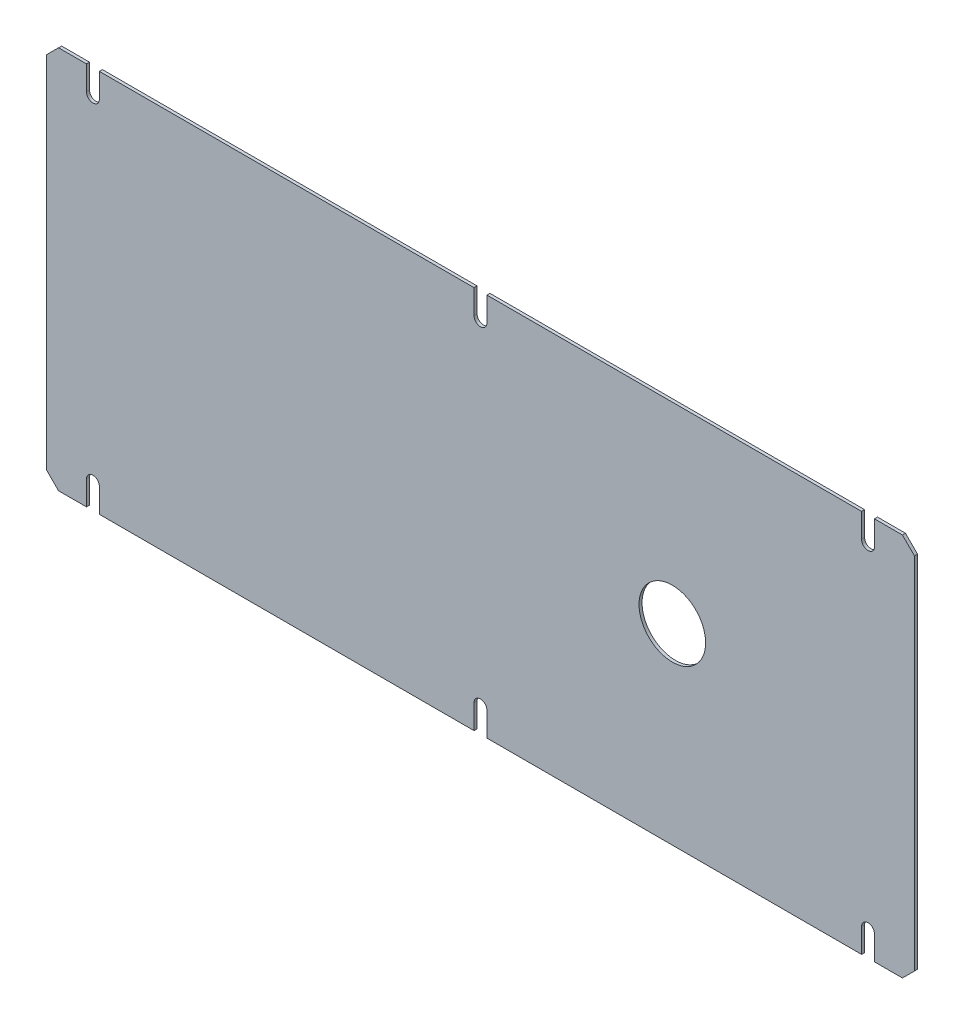
ISO-10303-21;
HEADER;
FILE_DESCRIPTION(('STEP AP214'),'2;1');
FILE_NAME('part.step','',(''),(''),'','','');
FILE_SCHEMA(('AUTOMOTIVE_DESIGN { 1 0 10303 214 1 1 1 1 }'));
ENDSEC;
DATA;
#1=APPLICATION_CONTEXT('core data for automotive mechanical design processes');
#2=APPLICATION_PROTOCOL_DEFINITION('international standard','automotive_design',2000,#1);
#3=PRODUCT_CONTEXT('',#1,'mechanical');
#4=PRODUCT('Part','Part','',(#3));
#5=PRODUCT_RELATED_PRODUCT_CATEGORY('part','',(#4));
#6=PRODUCT_DEFINITION_FORMATION('','',#4);
#7=PRODUCT_DEFINITION_CONTEXT('part definition',#1,'design');
#8=PRODUCT_DEFINITION('design','',#6,#7);
#9=PRODUCT_DEFINITION_SHAPE('','',#8);
#10=(LENGTH_UNIT() NAMED_UNIT(*) SI_UNIT(.MILLI.,.METRE.));
#11=(NAMED_UNIT(*) PLANE_ANGLE_UNIT() SI_UNIT($,.RADIAN.));
#12=(NAMED_UNIT(*) SI_UNIT($,.STERADIAN.) SOLID_ANGLE_UNIT());
#13=UNCERTAINTY_MEASURE_WITH_UNIT(LENGTH_MEASURE(1.E-05),#10,'distance_accuracy_value','');
#14=(GEOMETRIC_REPRESENTATION_CONTEXT(3) GLOBAL_UNCERTAINTY_ASSIGNED_CONTEXT((#13)) GLOBAL_UNIT_ASSIGNED_CONTEXT((#10,
#11,#12)) REPRESENTATION_CONTEXT('',''));
#15=CARTESIAN_POINT('',(0.,0.,0.));
#16=DIRECTION('',(0.,0.,1.));
#17=DIRECTION('',(1.,0.,0.));
#18=AXIS2_PLACEMENT_3D('',#15,#16,#17);
#19=CARTESIAN_POINT('',(-227.584,100.584,1.5875));
#20=DIRECTION('',(0.,-1.,0.));
#21=DIRECTION('',(0.,0.,-1.));
#22=AXIS2_PLACEMENT_3D('',#19,#20,#21);
#23=PLANE('',#22);
#24=DIRECTION('',(-1.,0.,0.));
#25=VECTOR('',#24,1.);
#26=CARTESIAN_POINT('',(-227.584,100.584,0.));
#27=LINE('',#26,#25);
#28=CARTESIAN_POINT('',(-206.5782,100.584,0.));
#29=VERTEX_POINT('',#28);
#30=CARTESIAN_POINT('',(-221.234,100.584,0.));
#31=VERTEX_POINT('',#30);
#32=EDGE_CURVE('E319',#29,#31,#27,.T.);
#33=ORIENTED_EDGE('',*,*,#32,.T.);
#34=DIRECTION('',(0.,0.,1.));
#35=VECTOR('',#34,1.);
#36=CARTESIAN_POINT('',(-221.234,100.584,1.5875));
#37=LINE('',#36,#35);
#38=CARTESIAN_POINT('',(-221.234,100.584,1.5875));
#39=VERTEX_POINT('',#38);
#40=EDGE_CURVE('E351',#31,#39,#37,.T.);
#41=ORIENTED_EDGE('',*,*,#40,.T.);
#42=DIRECTION('',(-1.,0.,0.));
#43=VECTOR('',#42,1.);
#44=CARTESIAN_POINT('',(-227.584,100.584,1.5875));
#45=LINE('',#44,#43);
#46=CARTESIAN_POINT('',(-206.5782,100.584,1.5875));
#47=VERTEX_POINT('',#46);
#48=EDGE_CURVE('E306',#47,#39,#45,.T.);
#49=ORIENTED_EDGE('',*,*,#48,.F.);
#50=DIRECTION('',(0.,0.,-1.));
#51=VECTOR('',#50,1.);
#52=CARTESIAN_POINT('',(-206.5782,100.584,-0.000999999999999916));
#53=LINE('',#52,#51);
#54=EDGE_CURVE('E864',#47,#29,#53,.T.);
#55=ORIENTED_EDGE('',*,*,#54,.T.);
#56=EDGE_LOOP('',(#33,#41,#49,#55));
#57=FACE_BOUND('',#56,.T.);
#58=ADVANCED_FACE('F38',(#57),#23,.F.);
#59=DIRECTION('',(0.,0.,1.));
#60=VECTOR('',#59,1.);
#61=CARTESIAN_POINT('',(-199.8218,100.584,-0.000999999999999916));
#62=LINE('',#61,#60);
#63=CARTESIAN_POINT('',(-199.8218,100.584,0.));
#64=VERTEX_POINT('',#63);
#65=CARTESIAN_POINT('',(-199.8218,100.584,1.5875));
#66=VERTEX_POINT('',#65);
#67=EDGE_CURVE('E887',#64,#66,#62,.T.);
#68=ORIENTED_EDGE('',*,*,#67,.T.);
#69=CARTESIAN_POINT('',(-3.3781999999999,100.584,1.5875));
#70=VERTEX_POINT('',#69);
#71=EDGE_CURVE('E270',#70,#66,#45,.T.);
#72=ORIENTED_EDGE('',*,*,#71,.F.);
#73=DIRECTION('',(0.,0.,-1.));
#74=VECTOR('',#73,1.);
#75=CARTESIAN_POINT('',(-3.3781999999999,100.584,-0.000999999999999916));
#76=LINE('',#75,#74);
#77=CARTESIAN_POINT('',(-3.3781999999999,100.584,0.));
#78=VERTEX_POINT('',#77);
#79=EDGE_CURVE('E413',#70,#78,#76,.T.);
#80=ORIENTED_EDGE('',*,*,#79,.T.);
#81=EDGE_CURVE('E865',#78,#64,#27,.T.);
#82=ORIENTED_EDGE('',*,*,#81,.T.);
#83=EDGE_LOOP('',(#68,#72,#80,#82));
#84=FACE_BOUND('',#83,.T.);
#85=ADVANCED_FACE('F508',(#84),#23,.F.);
#86=CARTESIAN_POINT('',(221.234,100.584,1.5875));
#87=VERTEX_POINT('',#86);
#88=CARTESIAN_POINT('',(206.5782,100.584,1.5875));
#89=VERTEX_POINT('',#88);
#90=EDGE_CURVE('E308',#87,#89,#45,.T.);
#91=ORIENTED_EDGE('',*,*,#90,.F.);
#92=DIRECTION('',(0.,0.,-1.));
#93=VECTOR('',#92,1.);
#94=CARTESIAN_POINT('',(221.234,100.584,1.5875));
#95=LINE('',#94,#93);
#96=CARTESIAN_POINT('',(221.234,100.584,0.));
#97=VERTEX_POINT('',#96);
#98=EDGE_CURVE('E12',#87,#97,#95,.T.);
#99=ORIENTED_EDGE('',*,*,#98,.T.);
#100=CARTESIAN_POINT('',(206.5782,100.584,0.));
#101=VERTEX_POINT('',#100);
#102=EDGE_CURVE('E320',#97,#101,#27,.T.);
#103=ORIENTED_EDGE('',*,*,#102,.T.);
#104=DIRECTION('',(0.,0.,1.));
#105=VECTOR('',#104,1.);
#106=CARTESIAN_POINT('',(206.5782,100.584,-0.000999999999999916));
#107=LINE('',#106,#105);
#108=EDGE_CURVE('E385',#101,#89,#107,.T.);
#109=ORIENTED_EDGE('',*,*,#108,.T.);
#110=EDGE_LOOP('',(#91,#99,#103,#109));
#111=FACE_BOUND('',#110,.T.);
#112=ADVANCED_FACE('F382',(#111),#23,.F.);
#113=DIRECTION('',(0.,0.,-1.));
#114=VECTOR('',#113,1.);
#115=CARTESIAN_POINT('',(199.8218,100.584,-0.000999999999999916));
#116=LINE('',#115,#114);
#117=CARTESIAN_POINT('',(199.8218,100.584,1.5875));
#118=VERTEX_POINT('',#117);
#119=CARTESIAN_POINT('',(199.8218,100.584,0.));
#120=VERTEX_POINT('',#119);
#121=EDGE_CURVE('E873',#118,#120,#116,.T.);
#122=ORIENTED_EDGE('',*,*,#121,.T.);
#123=CARTESIAN_POINT('',(3.37820000000009,100.584,0.));
#124=VERTEX_POINT('',#123);
#125=EDGE_CURVE('E323',#120,#124,#27,.T.);
#126=ORIENTED_EDGE('',*,*,#125,.T.);
#127=DIRECTION('',(0.,0.,1.));
#128=VECTOR('',#127,1.);
#129=CARTESIAN_POINT('',(3.37820000000009,100.584,-0.000999999999999916));
#130=LINE('',#129,#128);
#131=CARTESIAN_POINT('',(3.37820000000009,100.584,1.5875));
#132=VERTEX_POINT('',#131);
#133=EDGE_CURVE('E410',#124,#132,#130,.T.);
#134=ORIENTED_EDGE('',*,*,#133,.T.);
#135=EDGE_CURVE('E311',#118,#132,#45,.T.);
#136=ORIENTED_EDGE('',*,*,#135,.F.);
#137=EDGE_LOOP('',(#122,#126,#134,#136));
#138=FACE_BOUND('',#137,.T.);
#139=ADVANCED_FACE('F496',(#138),#23,.F.);
#140=CARTESIAN_POINT('',(0.,0.,1.5875));
#141=DIRECTION('',(0.,0.,1.));
#142=DIRECTION('',(1.,0.,0.));
#143=AXIS2_PLACEMENT_3D('',#140,#141,#142);
#144=PLANE('',#143);
#145=CARTESIAN_POINT('',(100.584,0.,1.5875));
#146=DIRECTION('',(0.,0.,1.));
#147=DIRECTION('',(1.,0.,0.));
#148=AXIS2_PLACEMENT_3D('',#145,#146,#147);
#149=CIRCLE('',#148,17.4625);
#150=CARTESIAN_POINT('',(118.0465,0.,1.5875));
#151=VERTEX_POINT('',#150);
#152=EDGE_CURVE('E282',#151,#151,#149,.T.);
#153=ORIENTED_EDGE('',*,*,#152,.F.);
#154=EDGE_LOOP('',(#153));
#155=FACE_BOUND('',#154,.T.);
#156=DIRECTION('',(0.,-1.,0.));
#157=VECTOR('',#156,1.);
#158=CARTESIAN_POINT('',(-227.584,100.584,1.5875));
#159=LINE('',#158,#157);
#160=CARTESIAN_POINT('',(-227.584,94.2340000000001,1.5875));
#161=VERTEX_POINT('',#160);
#162=CARTESIAN_POINT('',(-227.584,-94.234,1.5875));
#163=VERTEX_POINT('',#162);
#164=EDGE_CURVE('E310',#161,#163,#159,.T.);
#165=ORIENTED_EDGE('',*,*,#164,.T.);
#166=DIRECTION('',(-0.707106781186548,0.707106781186548,0.));
#167=VECTOR('',#166,1.);
#168=CARTESIAN_POINT('',(-160.909,-160.909,1.5875));
#169=LINE('',#168,#167);
#170=CARTESIAN_POINT('',(-221.234,-100.584,1.5875));
#171=VERTEX_POINT('',#170);
#172=EDGE_CURVE('E349',#163,#171,#169,.F.);
#173=ORIENTED_EDGE('',*,*,#172,.T.);
#174=DIRECTION('',(1.,0.,0.));
#175=VECTOR('',#174,1.);
#176=CARTESIAN_POINT('',(-227.584,-100.584,1.5875));
#177=LINE('',#176,#175);
#178=CARTESIAN_POINT('',(-206.5782,-100.584,1.5875));
#179=VERTEX_POINT('',#178);
#180=EDGE_CURVE('E314',#171,#179,#177,.T.);
#181=ORIENTED_EDGE('',*,*,#180,.T.);
#182=DIRECTION('',(0.,-1.,0.));
#183=VECTOR('',#182,1.);
#184=CARTESIAN_POINT('',(-206.5782,-87.884,1.5875));
#185=LINE('',#184,#183);
#186=CARTESIAN_POINT('',(-206.5782,-87.884,1.5875));
#187=VERTEX_POINT('',#186);
#188=EDGE_CURVE('E441',#187,#179,#185,.T.);
#189=ORIENTED_EDGE('',*,*,#188,.F.);
#190=CARTESIAN_POINT('',(-203.2,-87.884,1.5875));
#191=DIRECTION('',(0.,0.,1.));
#192=DIRECTION('',(1.,0.,0.));
#193=AXIS2_PLACEMENT_3D('',#190,#191,#192);
#194=CIRCLE('',#193,3.3782);
#195=CARTESIAN_POINT('',(-199.8218,-87.884,1.5875));
#196=VERTEX_POINT('',#195);
#197=EDGE_CURVE('E291',#196,#187,#194,.T.);
#198=ORIENTED_EDGE('',*,*,#197,.F.);
#199=DIRECTION('',(0.,1.,0.));
#200=VECTOR('',#199,1.);
#201=CARTESIAN_POINT('',(-199.8218,-87.884,1.5875));
#202=LINE('',#201,#200);
#203=CARTESIAN_POINT('',(-199.8218,-100.584,1.5875));
#204=VERTEX_POINT('',#203);
#205=EDGE_CURVE('E444',#204,#196,#202,.T.);
#206=ORIENTED_EDGE('',*,*,#205,.F.);
#207=CARTESIAN_POINT('',(-3.3781999999999,-100.584,1.5875));
#208=VERTEX_POINT('',#207);
#209=EDGE_CURVE('E317',#204,#208,#177,.T.);
#210=ORIENTED_EDGE('',*,*,#209,.T.);
#211=DIRECTION('',(0.,-1.,0.));
#212=VECTOR('',#211,1.);
#213=CARTESIAN_POINT('',(-3.3781999999999,-87.8839999999999,1.5875));
#214=LINE('',#213,#212);
#215=CARTESIAN_POINT('',(-3.3781999999999,-87.8839999999999,1.5875));
#216=VERTEX_POINT('',#215);
#217=EDGE_CURVE('E474',#216,#208,#214,.T.);
#218=ORIENTED_EDGE('',*,*,#217,.F.);
#219=CARTESIAN_POINT('',(0.,-87.8839999999999,1.5875));
#220=DIRECTION('',(0.,0.,1.));
#221=DIRECTION('',(1.,0.,0.));
#222=AXIS2_PLACEMENT_3D('',#219,#220,#221);
#223=CIRCLE('',#222,3.37819999999999);
#224=CARTESIAN_POINT('',(3.37820000000007,-87.8839999999999,1.5875));
#225=VERTEX_POINT('',#224);
#226=EDGE_CURVE('E448',#225,#216,#223,.T.);
#227=ORIENTED_EDGE('',*,*,#226,.F.);
#228=DIRECTION('',(0.,1.,0.));
#229=VECTOR('',#228,1.);
#230=CARTESIAN_POINT('',(3.37820000000009,-87.8839999999999,1.5875));
#231=LINE('',#230,#229);
#232=CARTESIAN_POINT('',(3.37820000000009,-100.584,1.5875));
#233=VERTEX_POINT('',#232);
#234=EDGE_CURVE('E476',#233,#225,#231,.T.);
#235=ORIENTED_EDGE('',*,*,#234,.F.);
#236=CARTESIAN_POINT('',(199.8218,-100.584,1.5875));
#237=VERTEX_POINT('',#236);
#238=EDGE_CURVE('E369',#233,#237,#177,.T.);
#239=ORIENTED_EDGE('',*,*,#238,.T.);
#240=DIRECTION('',(0.,-1.,0.));
#241=VECTOR('',#240,1.);
#242=CARTESIAN_POINT('',(199.8218,-87.8839999999999,1.5875));
#243=LINE('',#242,#241);
#244=CARTESIAN_POINT('',(199.8218,-87.8839999999999,1.5875));
#245=VERTEX_POINT('',#244);
#246=EDGE_CURVE('E432',#245,#237,#243,.T.);
#247=ORIENTED_EDGE('',*,*,#246,.F.);
#248=CARTESIAN_POINT('',(203.2,-87.8839999999999,1.5875));
#249=DIRECTION('',(0.,0.,1.));
#250=DIRECTION('',(1.,0.,0.));
#251=AXIS2_PLACEMENT_3D('',#248,#249,#250);
#252=CIRCLE('',#251,3.3782);
#253=CARTESIAN_POINT('',(206.5782,-87.8839999999999,1.5875));
#254=VERTEX_POINT('',#253);
#255=EDGE_CURVE('E297',#254,#245,#252,.T.);
#256=ORIENTED_EDGE('',*,*,#255,.F.);
#257=DIRECTION('',(0.,1.,0.));
#258=VECTOR('',#257,1.);
#259=CARTESIAN_POINT('',(206.5782,-87.8839999999999,1.5875));
#260=LINE('',#259,#258);
#261=CARTESIAN_POINT('',(206.5782,-100.584,1.5875));
#262=VERTEX_POINT('',#261);
#263=EDGE_CURVE('E368',#262,#254,#260,.T.);
#264=ORIENTED_EDGE('',*,*,#263,.F.);
#265=CARTESIAN_POINT('',(221.234,-100.584,1.5875));
#266=VERTEX_POINT('',#265);
#267=EDGE_CURVE('E313',#262,#266,#177,.T.);
#268=ORIENTED_EDGE('',*,*,#267,.T.);
#269=DIRECTION('',(-0.707106781186548,-0.707106781186548,0.));
#270=VECTOR('',#269,1.);
#271=CARTESIAN_POINT('',(160.909,-160.909,1.5875));
#272=LINE('',#271,#270);
#273=CARTESIAN_POINT('',(227.584,-94.2340000000001,1.5875));
#274=VERTEX_POINT('',#273);
#275=EDGE_CURVE('E345',#266,#274,#272,.F.);
#276=ORIENTED_EDGE('',*,*,#275,.T.);
#277=DIRECTION('',(0.,1.,0.));
#278=VECTOR('',#277,1.);
#279=CARTESIAN_POINT('',(227.584,100.584,1.5875));
#280=LINE('',#279,#278);
#281=CARTESIAN_POINT('',(227.584,94.2340000000001,1.5875));
#282=VERTEX_POINT('',#281);
#283=EDGE_CURVE('E304',#274,#282,#280,.T.);
#284=ORIENTED_EDGE('',*,*,#283,.T.);
#285=DIRECTION('',(0.707106781186548,-0.707106781186548,0.));
#286=VECTOR('',#285,1.);
#287=CARTESIAN_POINT('',(160.909,160.909,1.5875));
#288=LINE('',#287,#286);
#289=EDGE_CURVE('E53',#282,#87,#288,.F.);
#290=ORIENTED_EDGE('',*,*,#289,.T.);
#291=ORIENTED_EDGE('',*,*,#90,.T.);
#292=DIRECTION('',(0.,-1.,0.));
#293=VECTOR('',#292,1.);
#294=CARTESIAN_POINT('',(206.5782,87.8839999999999,1.5875));
#295=LINE('',#294,#293);
#296=CARTESIAN_POINT('',(206.5782,87.8839999999999,1.5875));
#297=VERTEX_POINT('',#296);
#298=EDGE_CURVE('E389',#89,#297,#295,.T.);
#299=ORIENTED_EDGE('',*,*,#298,.T.);
#300=CARTESIAN_POINT('',(203.2,87.8840000000001,1.5875));
#301=DIRECTION('',(0.,0.,1.));
#302=DIRECTION('',(1.,0.,0.));
#303=AXIS2_PLACEMENT_3D('',#300,#301,#302);
#304=CIRCLE('',#303,3.3782);
#305=CARTESIAN_POINT('',(199.8218,87.8840000000001,1.5875));
#306=VERTEX_POINT('',#305);
#307=EDGE_CURVE('E279',#306,#297,#304,.T.);
#308=ORIENTED_EDGE('',*,*,#307,.F.);
#309=DIRECTION('',(0.,1.,0.));
#310=VECTOR('',#309,1.);
#311=CARTESIAN_POINT('',(199.8218,87.8839999999999,1.5875));
#312=LINE('',#311,#310);
#313=EDGE_CURVE('E394',#306,#118,#312,.T.);
#314=ORIENTED_EDGE('',*,*,#313,.T.);
#315=ORIENTED_EDGE('',*,*,#135,.T.);
#316=DIRECTION('',(0.,-1.,0.));
#317=VECTOR('',#316,1.);
#318=CARTESIAN_POINT('',(3.37820000000009,87.8839999999999,1.5875));
#319=LINE('',#318,#317);
#320=CARTESIAN_POINT('',(3.37820000000009,87.8839999999999,1.5875));
#321=VERTEX_POINT('',#320);
#322=EDGE_CURVE('E424',#132,#321,#319,.T.);
#323=ORIENTED_EDGE('',*,*,#322,.T.);
#324=CARTESIAN_POINT('',(0.,87.884,1.5875));
#325=DIRECTION('',(0.,0.,1.));
#326=DIRECTION('',(1.,0.,0.));
#327=AXIS2_PLACEMENT_3D('',#324,#325,#326);
#328=CIRCLE('',#327,3.37819999999999);
#329=CARTESIAN_POINT('',(-3.37819999999993,87.884,1.5875));
#330=VERTEX_POINT('',#329);
#331=EDGE_CURVE('E484',#330,#321,#328,.T.);
#332=ORIENTED_EDGE('',*,*,#331,.F.);
#333=DIRECTION('',(0.,1.,0.));
#334=VECTOR('',#333,1.);
#335=CARTESIAN_POINT('',(-3.3781999999999,87.8839999999999,1.5875));
#336=LINE('',#335,#334);
#337=EDGE_CURVE('E422',#330,#70,#336,.T.);
#338=ORIENTED_EDGE('',*,*,#337,.T.);
#339=ORIENTED_EDGE('',*,*,#71,.T.);
#340=DIRECTION('',(0.,-1.,0.));
#341=VECTOR('',#340,1.);
#342=CARTESIAN_POINT('',(-199.8218,87.884,1.5875));
#343=LINE('',#342,#341);
#344=CARTESIAN_POINT('',(-199.8218,87.884,1.5875));
#345=VERTEX_POINT('',#344);
#346=EDGE_CURVE('E251',#66,#345,#343,.T.);
#347=ORIENTED_EDGE('',*,*,#346,.T.);
#348=CARTESIAN_POINT('',(-203.2,87.884,1.5875));
#349=DIRECTION('',(0.,0.,1.));
#350=DIRECTION('',(1.,0.,0.));
#351=AXIS2_PLACEMENT_3D('',#348,#349,#350);
#352=CIRCLE('',#351,3.3782);
#353=CARTESIAN_POINT('',(-206.5782,87.884,1.5875));
#354=VERTEX_POINT('',#353);
#355=EDGE_CURVE('E267',#354,#345,#352,.T.);
#356=ORIENTED_EDGE('',*,*,#355,.F.);
#357=DIRECTION('',(0.,1.,0.));
#358=VECTOR('',#357,1.);
#359=CARTESIAN_POINT('',(-206.5782,87.884,1.5875));
#360=LINE('',#359,#358);
#361=EDGE_CURVE('E272',#354,#47,#360,.T.);
#362=ORIENTED_EDGE('',*,*,#361,.T.);
#363=ORIENTED_EDGE('',*,*,#48,.T.);
#364=DIRECTION('',(0.707106781186548,0.707106781186548,0.));
#365=VECTOR('',#364,1.);
#366=CARTESIAN_POINT('',(-160.909,160.909,1.5875));
#367=LINE('',#366,#365);
#368=EDGE_CURVE('E347',#39,#161,#367,.F.);
#369=ORIENTED_EDGE('',*,*,#368,.T.);
#370=EDGE_LOOP('',(#165,#173,#181,#189,#198,#206,#210,#218,#227,#235,#239,#247,#256,#264,#268,
#276,#284,#290,#291,#299,#308,#314,#315,#323,#332,#338,#339,#347,#356,#362,#363,#369));
#371=FACE_BOUND('',#370,.T.);
#372=ADVANCED_FACE('F265',(#155,#371),#144,.T.);
#373=CARTESIAN_POINT('',(0.,0.,0.));
#374=DIRECTION('',(0.,0.,1.));
#375=DIRECTION('',(1.,0.,0.));
#376=AXIS2_PLACEMENT_3D('',#373,#374,#375);
#377=PLANE('',#376);
#378=CARTESIAN_POINT('',(100.584,0.,0.));
#379=DIRECTION('',(0.,0.,1.));
#380=DIRECTION('',(1.,0.,0.));
#381=AXIS2_PLACEMENT_3D('',#378,#379,#380);
#382=CIRCLE('',#381,17.4625);
#383=CARTESIAN_POINT('',(118.0465,0.,0.));
#384=VERTEX_POINT('',#383);
#385=EDGE_CURVE('E277',#384,#384,#382,.F.);
#386=ORIENTED_EDGE('',*,*,#385,.F.);
#387=EDGE_LOOP('',(#386));
#388=FACE_BOUND('',#387,.T.);
#389=DIRECTION('',(1.,0.,0.));
#390=VECTOR('',#389,1.);
#391=CARTESIAN_POINT('',(-227.584,-100.584,0.));
#392=LINE('',#391,#390);
#393=CARTESIAN_POINT('',(-221.234,-100.584,0.));
#394=VERTEX_POINT('',#393);
#395=CARTESIAN_POINT('',(-206.5782,-100.584,0.));
#396=VERTEX_POINT('',#395);
#397=EDGE_CURVE('E307',#394,#396,#392,.T.);
#398=ORIENTED_EDGE('',*,*,#397,.F.);
#399=DIRECTION('',(0.707106781186548,-0.707106781186548,0.));
#400=VECTOR('',#399,1.);
#401=CARTESIAN_POINT('',(-221.234,-100.584,0.));
#402=LINE('',#401,#400);
#403=CARTESIAN_POINT('',(-227.584,-94.234,0.));
#404=VERTEX_POINT('',#403);
#405=EDGE_CURVE('E337',#394,#404,#402,.F.);
#406=ORIENTED_EDGE('',*,*,#405,.T.);
#407=DIRECTION('',(0.,-1.,0.));
#408=VECTOR('',#407,1.);
#409=CARTESIAN_POINT('',(-227.584,100.584,0.));
#410=LINE('',#409,#408);
#411=CARTESIAN_POINT('',(-227.584,94.2340000000001,0.));
#412=VERTEX_POINT('',#411);
#413=EDGE_CURVE('E322',#412,#404,#410,.T.);
#414=ORIENTED_EDGE('',*,*,#413,.F.);
#415=DIRECTION('',(-0.707106781186548,-0.707106781186548,0.));
#416=VECTOR('',#415,1.);
#417=CARTESIAN_POINT('',(-227.584,94.2340000000001,0.));
#418=LINE('',#417,#416);
#419=EDGE_CURVE('E335',#412,#31,#418,.F.);
#420=ORIENTED_EDGE('',*,*,#419,.T.);
#421=ORIENTED_EDGE('',*,*,#32,.F.);
#422=DIRECTION('',(0.,-1.,0.));
#423=VECTOR('',#422,1.);
#424=CARTESIAN_POINT('',(-206.5782,87.884,0.));
#425=LINE('',#424,#423);
#426=CARTESIAN_POINT('',(-206.5782,87.884,0.));
#427=VERTEX_POINT('',#426);
#428=EDGE_CURVE('E877',#29,#427,#425,.T.);
#429=ORIENTED_EDGE('',*,*,#428,.T.);
#430=CARTESIAN_POINT('',(-203.2,87.884,0.));
#431=DIRECTION('',(0.,0.,1.));
#432=DIRECTION('',(1.,0.,0.));
#433=AXIS2_PLACEMENT_3D('',#430,#431,#432);
#434=CIRCLE('',#433,3.3782);
#435=CARTESIAN_POINT('',(-199.8218,87.884,0.));
#436=VERTEX_POINT('',#435);
#437=EDGE_CURVE('E276',#427,#436,#434,.T.);
#438=ORIENTED_EDGE('',*,*,#437,.T.);
#439=DIRECTION('',(0.,1.,0.));
#440=VECTOR('',#439,1.);
#441=CARTESIAN_POINT('',(-199.8218,87.884,0.));
#442=LINE('',#441,#440);
#443=EDGE_CURVE('E254',#436,#64,#442,.T.);
#444=ORIENTED_EDGE('',*,*,#443,.T.);
#445=ORIENTED_EDGE('',*,*,#81,.F.);
#446=DIRECTION('',(0.,-1.,0.));
#447=VECTOR('',#446,1.);
#448=CARTESIAN_POINT('',(-3.3781999999999,87.8839999999999,0.));
#449=LINE('',#448,#447);
#450=CARTESIAN_POINT('',(-3.3781999999999,87.8839999999999,0.));
#451=VERTEX_POINT('',#450);
#452=EDGE_CURVE('E419',#78,#451,#449,.T.);
#453=ORIENTED_EDGE('',*,*,#452,.T.);
#454=CARTESIAN_POINT('',(0.,87.884,0.));
#455=DIRECTION('',(0.,0.,1.));
#456=DIRECTION('',(1.,0.,0.));
#457=AXIS2_PLACEMENT_3D('',#454,#455,#456);
#458=CIRCLE('',#457,3.37819999999999);
#459=CARTESIAN_POINT('',(3.37820000000005,87.884,0.));
#460=VERTEX_POINT('',#459);
#461=EDGE_CURVE('E487',#451,#460,#458,.T.);
#462=ORIENTED_EDGE('',*,*,#461,.T.);
#463=DIRECTION('',(0.,1.,0.));
#464=VECTOR('',#463,1.);
#465=CARTESIAN_POINT('',(3.37820000000009,87.8839999999999,0.));
#466=LINE('',#465,#464);
#467=EDGE_CURVE('E416',#460,#124,#466,.T.);
#468=ORIENTED_EDGE('',*,*,#467,.T.);
#469=ORIENTED_EDGE('',*,*,#125,.F.);
#470=DIRECTION('',(0.,-1.,0.));
#471=VECTOR('',#470,1.);
#472=CARTESIAN_POINT('',(199.8218,87.8839999999999,0.));
#473=LINE('',#472,#471);
#474=CARTESIAN_POINT('',(199.8218,87.8840000000001,0.));
#475=VERTEX_POINT('',#474);
#476=EDGE_CURVE('E260',#120,#475,#473,.T.);
#477=ORIENTED_EDGE('',*,*,#476,.T.);
#478=CARTESIAN_POINT('',(203.2,87.8840000000001,0.));
#479=DIRECTION('',(0.,0.,1.));
#480=DIRECTION('',(1.,0.,0.));
#481=AXIS2_PLACEMENT_3D('',#478,#479,#480);
#482=CIRCLE('',#481,3.3782);
#483=CARTESIAN_POINT('',(206.5782,87.8840000000001,0.));
#484=VERTEX_POINT('',#483);
#485=EDGE_CURVE('E288',#475,#484,#482,.T.);
#486=ORIENTED_EDGE('',*,*,#485,.T.);
#487=DIRECTION('',(0.,1.,0.));
#488=VECTOR('',#487,1.);
#489=CARTESIAN_POINT('',(206.5782,87.8839999999999,0.));
#490=LINE('',#489,#488);
#491=EDGE_CURVE('E395',#484,#101,#490,.T.);
#492=ORIENTED_EDGE('',*,*,#491,.T.);
#493=ORIENTED_EDGE('',*,*,#102,.F.);
#494=DIRECTION('',(-0.707106781186548,0.707106781186548,0.));
#495=VECTOR('',#494,1.);
#496=CARTESIAN_POINT('',(221.234,100.584,0.));
#497=LINE('',#496,#495);
#498=CARTESIAN_POINT('',(227.584,94.2340000000001,0.));
#499=VERTEX_POINT('',#498);
#500=EDGE_CURVE('E331',#97,#499,#497,.F.);
#501=ORIENTED_EDGE('',*,*,#500,.T.);
#502=DIRECTION('',(0.,1.,0.));
#503=VECTOR('',#502,1.);
#504=CARTESIAN_POINT('',(227.584,100.584,0.));
#505=LINE('',#504,#503);
#506=CARTESIAN_POINT('',(227.584,-94.2340000000001,0.));
#507=VERTEX_POINT('',#506);
#508=EDGE_CURVE('E303',#507,#499,#505,.T.);
#509=ORIENTED_EDGE('',*,*,#508,.F.);
#510=DIRECTION('',(0.707106781186548,0.707106781186548,0.));
#511=VECTOR('',#510,1.);
#512=CARTESIAN_POINT('',(227.584,-94.2340000000001,0.));
#513=LINE('',#512,#511);
#514=CARTESIAN_POINT('',(221.234,-100.584,0.));
#515=VERTEX_POINT('',#514);
#516=EDGE_CURVE('E333',#507,#515,#513,.F.);
#517=ORIENTED_EDGE('',*,*,#516,.T.);
#518=CARTESIAN_POINT('',(206.5782,-100.584,0.));
#519=VERTEX_POINT('',#518);
#520=EDGE_CURVE('E326',#519,#515,#392,.T.);
#521=ORIENTED_EDGE('',*,*,#520,.F.);
#522=DIRECTION('',(0.,-1.,0.));
#523=VECTOR('',#522,1.);
#524=CARTESIAN_POINT('',(206.5782,-87.8839999999999,0.));
#525=LINE('',#524,#523);
#526=CARTESIAN_POINT('',(206.5782,-87.8839999999999,0.));
#527=VERTEX_POINT('',#526);
#528=EDGE_CURVE('E460',#527,#519,#525,.T.);
#529=ORIENTED_EDGE('',*,*,#528,.F.);
#530=CARTESIAN_POINT('',(203.2,-87.8839999999999,0.));
#531=DIRECTION('',(0.,0.,1.));
#532=DIRECTION('',(1.,0.,0.));
#533=AXIS2_PLACEMENT_3D('',#530,#531,#532);
#534=CIRCLE('',#533,3.3782);
#535=CARTESIAN_POINT('',(199.8218,-87.8839999999999,0.));
#536=VERTEX_POINT('',#535);
#537=EDGE_CURVE('E300',#527,#536,#534,.T.);
#538=ORIENTED_EDGE('',*,*,#537,.T.);
#539=DIRECTION('',(0.,1.,0.));
#540=VECTOR('',#539,1.);
#541=CARTESIAN_POINT('',(199.8218,-87.8839999999999,0.));
#542=LINE('',#541,#540);
#543=CARTESIAN_POINT('',(199.8218,-100.584,0.));
#544=VERTEX_POINT('',#543);
#545=EDGE_CURVE('E458',#544,#536,#542,.T.);
#546=ORIENTED_EDGE('',*,*,#545,.F.);
#547=CARTESIAN_POINT('',(3.37820000000009,-100.584,0.));
#548=VERTEX_POINT('',#547);
#549=EDGE_CURVE('E833',#548,#544,#392,.T.);
#550=ORIENTED_EDGE('',*,*,#549,.F.);
#551=DIRECTION('',(0.,-1.,0.));
#552=VECTOR('',#551,1.);
#553=CARTESIAN_POINT('',(3.37820000000009,-87.8839999999999,0.));
#554=LINE('',#553,#552);
#555=CARTESIAN_POINT('',(3.37820000000009,-87.8839999999999,0.));
#556=VERTEX_POINT('',#555);
#557=EDGE_CURVE('E452',#556,#548,#554,.T.);
#558=ORIENTED_EDGE('',*,*,#557,.F.);
#559=CARTESIAN_POINT('',(0.,-87.8839999999999,0.));
#560=DIRECTION('',(0.,0.,1.));
#561=DIRECTION('',(1.,0.,0.));
#562=AXIS2_PLACEMENT_3D('',#559,#560,#561);
#563=CIRCLE('',#562,3.37819999999999);
#564=CARTESIAN_POINT('',(-3.37819999999991,-87.8839999999999,0.));
#565=VERTEX_POINT('',#564);
#566=EDGE_CURVE('E481',#556,#565,#563,.T.);
#567=ORIENTED_EDGE('',*,*,#566,.T.);
#568=DIRECTION('',(0.,1.,0.));
#569=VECTOR('',#568,1.);
#570=CARTESIAN_POINT('',(-3.3781999999999,-87.8839999999999,0.));
#571=LINE('',#570,#569);
#572=CARTESIAN_POINT('',(-3.3781999999999,-100.584,0.));
#573=VERTEX_POINT('',#572);
#574=EDGE_CURVE('E472',#573,#565,#571,.T.);
#575=ORIENTED_EDGE('',*,*,#574,.F.);
#576=CARTESIAN_POINT('',(-199.8218,-100.584,0.));
#577=VERTEX_POINT('',#576);
#578=EDGE_CURVE('E328',#577,#573,#392,.T.);
#579=ORIENTED_EDGE('',*,*,#578,.F.);
#580=DIRECTION('',(0.,-1.,0.));
#581=VECTOR('',#580,1.);
#582=CARTESIAN_POINT('',(-199.8218,-87.884,0.));
#583=LINE('',#582,#581);
#584=CARTESIAN_POINT('',(-199.8218,-87.884,0.));
#585=VERTEX_POINT('',#584);
#586=EDGE_CURVE('E446',#585,#577,#583,.T.);
#587=ORIENTED_EDGE('',*,*,#586,.F.);
#588=CARTESIAN_POINT('',(-203.2,-87.884,0.));
#589=DIRECTION('',(0.,0.,1.));
#590=DIRECTION('',(1.,0.,0.));
#591=AXIS2_PLACEMENT_3D('',#588,#589,#590);
#592=CIRCLE('',#591,3.3782);
#593=CARTESIAN_POINT('',(-206.5782,-87.884,0.));
#594=VERTEX_POINT('',#593);
#595=EDGE_CURVE('E294',#585,#594,#592,.T.);
#596=ORIENTED_EDGE('',*,*,#595,.T.);
#597=DIRECTION('',(0.,1.,0.));
#598=VECTOR('',#597,1.);
#599=CARTESIAN_POINT('',(-206.5782,-87.884,0.));
#600=LINE('',#599,#598);
#601=EDGE_CURVE('E439',#396,#594,#600,.T.);
#602=ORIENTED_EDGE('',*,*,#601,.F.);
#603=EDGE_LOOP('',(#398,#406,#414,#420,#421,#429,#438,#444,#445,#453,#462,#468,#469,#477,#486,
#492,#493,#501,#509,#517,#521,#529,#538,#546,#550,#558,#567,#575,#579,#587,#596,#602));
#604=FACE_BOUND('',#603,.T.);
#605=ADVANCED_FACE('F376',(#388,#604),#377,.F.);
#606=CARTESIAN_POINT('',(-203.2,87.884,1.5875));
#607=DIRECTION('',(0.,0.,1.));
#608=DIRECTION('',(1.,0.,0.));
#609=AXIS2_PLACEMENT_3D('',#606,#607,#608);
#610=CYLINDRICAL_SURFACE('',#609,3.3782);
#611=DIRECTION('',(0.,0.,1.));
#612=VECTOR('',#611,1.);
#613=CARTESIAN_POINT('',(-206.5782,87.884,1.5875));
#614=LINE('',#613,#612);
#615=EDGE_CURVE('E259',#427,#354,#614,.T.);
#616=ORIENTED_EDGE('',*,*,#615,.T.);
#617=ORIENTED_EDGE('',*,*,#355,.T.);
#618=DIRECTION('',(0.,0.,1.));
#619=VECTOR('',#618,1.);
#620=CARTESIAN_POINT('',(-199.8218,87.884,1.5875));
#621=LINE('',#620,#619);
#622=EDGE_CURVE('E248',#345,#436,#621,.F.);
#623=ORIENTED_EDGE('',*,*,#622,.T.);
#624=ORIENTED_EDGE('',*,*,#437,.F.);
#625=EDGE_LOOP('',(#616,#617,#623,#624));
#626=FACE_BOUND('',#625,.T.);
#627=ADVANCED_FACE('F275',(#626),#610,.F.);
#628=CARTESIAN_POINT('',(0.,87.884,1.5875));
#629=DIRECTION('',(0.,0.,1.));
#630=DIRECTION('',(1.,0.,0.));
#631=AXIS2_PLACEMENT_3D('',#628,#629,#630);
#632=CYLINDRICAL_SURFACE('',#631,3.37819999999999);
#633=DIRECTION('',(0.,0.,1.));
#634=VECTOR('',#633,1.);
#635=CARTESIAN_POINT('',(-3.37819999999994,87.8839999999999,1.5875));
#636=LINE('',#635,#634);
#637=EDGE_CURVE('E407',#451,#330,#636,.T.);
#638=ORIENTED_EDGE('',*,*,#637,.T.);
#639=ORIENTED_EDGE('',*,*,#331,.T.);
#640=DIRECTION('',(0.,0.,1.));
#641=VECTOR('',#640,1.);
#642=CARTESIAN_POINT('',(3.37820000000005,87.8839999999999,1.5875));
#643=LINE('',#642,#641);
#644=EDGE_CURVE('E404',#321,#460,#643,.F.);
#645=ORIENTED_EDGE('',*,*,#644,.T.);
#646=ORIENTED_EDGE('',*,*,#461,.F.);
#647=EDGE_LOOP('',(#638,#639,#645,#646));
#648=FACE_BOUND('',#647,.T.);
#649=ADVANCED_FACE('F591',(#648),#632,.F.);
#650=CARTESIAN_POINT('',(-227.584,-100.584,1.5875));
#651=DIRECTION('',(0.,1.,0.));
#652=DIRECTION('',(0.,0.,1.));
#653=AXIS2_PLACEMENT_3D('',#650,#651,#652);
#654=PLANE('',#653);
#655=ORIENTED_EDGE('',*,*,#180,.F.);
#656=DIRECTION('',(0.,0.,-1.));
#657=VECTOR('',#656,1.);
#658=CARTESIAN_POINT('',(-221.234,-100.584,1.5875));
#659=LINE('',#658,#657);
#660=EDGE_CURVE('E316',#171,#394,#659,.T.);
#661=ORIENTED_EDGE('',*,*,#660,.T.);
#662=ORIENTED_EDGE('',*,*,#397,.T.);
#663=DIRECTION('',(0.,0.,-1.));
#664=VECTOR('',#663,1.);
#665=CARTESIAN_POINT('',(-206.5782,-100.584,-0.000999999999999916));
#666=LINE('',#665,#664);
#667=EDGE_CURVE('E436',#179,#396,#666,.T.);
#668=ORIENTED_EDGE('',*,*,#667,.F.);
#669=EDGE_LOOP('',(#655,#661,#662,#668));
#670=FACE_BOUND('',#669,.T.);
#671=ADVANCED_FACE('F581',(#670),#654,.F.);
#672=ORIENTED_EDGE('',*,*,#520,.T.);
#673=DIRECTION('',(0.,0.,1.));
#674=VECTOR('',#673,1.);
#675=CARTESIAN_POINT('',(221.234,-100.584,1.5875));
#676=LINE('',#675,#674);
#677=EDGE_CURVE('E46',#515,#266,#676,.T.);
#678=ORIENTED_EDGE('',*,*,#677,.T.);
#679=ORIENTED_EDGE('',*,*,#267,.F.);
#680=DIRECTION('',(0.,0.,1.));
#681=VECTOR('',#680,1.);
#682=CARTESIAN_POINT('',(206.5782,-100.584,-0.000999999999999916));
#683=LINE('',#682,#681);
#684=EDGE_CURVE('E456',#519,#262,#683,.T.);
#685=ORIENTED_EDGE('',*,*,#684,.F.);
#686=EDGE_LOOP('',(#672,#678,#679,#685));
#687=FACE_BOUND('',#686,.T.);
#688=ADVANCED_FACE('F361',(#687),#654,.F.);
#689=ORIENTED_EDGE('',*,*,#209,.F.);
#690=DIRECTION('',(0.,0.,1.));
#691=VECTOR('',#690,1.);
#692=CARTESIAN_POINT('',(-199.8218,-100.584,-0.000999999999999916));
#693=LINE('',#692,#691);
#694=EDGE_CURVE('E434',#577,#204,#693,.T.);
#695=ORIENTED_EDGE('',*,*,#694,.F.);
#696=ORIENTED_EDGE('',*,*,#578,.T.);
#697=DIRECTION('',(0.,0.,-1.));
#698=VECTOR('',#697,1.);
#699=CARTESIAN_POINT('',(-3.3781999999999,-100.584,-0.000999999999999916));
#700=LINE('',#699,#698);
#701=EDGE_CURVE('E470',#208,#573,#700,.T.);
#702=ORIENTED_EDGE('',*,*,#701,.F.);
#703=EDGE_LOOP('',(#689,#695,#696,#702));
#704=FACE_BOUND('',#703,.T.);
#705=ADVANCED_FACE('F580',(#704),#654,.F.);
#706=CARTESIAN_POINT('',(203.2,-87.8839999999999,1.5875));
#707=DIRECTION('',(0.,0.,1.));
#708=DIRECTION('',(1.,0.,0.));
#709=AXIS2_PLACEMENT_3D('',#706,#707,#708);
#710=CYLINDRICAL_SURFACE('',#709,3.3782);
#711=DIRECTION('',(0.,0.,1.));
#712=VECTOR('',#711,1.);
#713=CARTESIAN_POINT('',(206.5782,-87.8839999999999,1.5875));
#714=LINE('',#713,#712);
#715=EDGE_CURVE('E449',#254,#527,#714,.F.);
#716=ORIENTED_EDGE('',*,*,#715,.F.);
#717=ORIENTED_EDGE('',*,*,#255,.T.);
#718=DIRECTION('',(0.,0.,1.));
#719=VECTOR('',#718,1.);
#720=CARTESIAN_POINT('',(199.8218,-87.8839999999999,1.5875));
#721=LINE('',#720,#719);
#722=EDGE_CURVE('E451',#536,#245,#721,.T.);
#723=ORIENTED_EDGE('',*,*,#722,.F.);
#724=ORIENTED_EDGE('',*,*,#537,.F.);
#725=EDGE_LOOP('',(#716,#717,#723,#724));
#726=FACE_BOUND('',#725,.T.);
#727=ADVANCED_FACE('F521',(#726),#710,.F.);
#728=CARTESIAN_POINT('',(227.584,100.584,1.5875));
#729=DIRECTION('',(-1.,0.,0.));
#730=DIRECTION('',(0.,0.,1.));
#731=AXIS2_PLACEMENT_3D('',#728,#729,#730);
#732=PLANE('',#731);
#733=ORIENTED_EDGE('',*,*,#283,.F.);
#734=DIRECTION('',(0.,0.,-1.));
#735=VECTOR('',#734,1.);
#736=CARTESIAN_POINT('',(227.584,-94.2340000000001,1.5875));
#737=LINE('',#736,#735);
#738=EDGE_CURVE('E354',#274,#507,#737,.T.);
#739=ORIENTED_EDGE('',*,*,#738,.T.);
#740=ORIENTED_EDGE('',*,*,#508,.T.);
#741=DIRECTION('',(0.,0.,1.));
#742=VECTOR('',#741,1.);
#743=CARTESIAN_POINT('',(227.584,94.2340000000001,1.5875));
#744=LINE('',#743,#742);
#745=EDGE_CURVE('E61',#499,#282,#744,.T.);
#746=ORIENTED_EDGE('',*,*,#745,.T.);
#747=EDGE_LOOP('',(#733,#739,#740,#746));
#748=FACE_BOUND('',#747,.T.);
#749=ADVANCED_FACE('F373',(#748),#732,.F.);
#750=CARTESIAN_POINT('',(-227.584,100.584,1.5875));
#751=DIRECTION('',(1.,0.,0.));
#752=DIRECTION('',(0.,0.,-1.));
#753=AXIS2_PLACEMENT_3D('',#750,#751,#752);
#754=PLANE('',#753);
#755=ORIENTED_EDGE('',*,*,#413,.T.);
#756=DIRECTION('',(0.,0.,1.));
#757=VECTOR('',#756,1.);
#758=CARTESIAN_POINT('',(-227.584,-94.234,1.5875));
#759=LINE('',#758,#757);
#760=EDGE_CURVE('E342',#404,#163,#759,.T.);
#761=ORIENTED_EDGE('',*,*,#760,.T.);
#762=ORIENTED_EDGE('',*,*,#164,.F.);
#763=DIRECTION('',(0.,0.,-1.));
#764=VECTOR('',#763,1.);
#765=CARTESIAN_POINT('',(-227.584,94.2340000000001,1.5875));
#766=LINE('',#765,#764);
#767=EDGE_CURVE('E339',#161,#412,#766,.T.);
#768=ORIENTED_EDGE('',*,*,#767,.T.);
#769=EDGE_LOOP('',(#755,#761,#762,#768));
#770=FACE_BOUND('',#769,.T.);
#771=ADVANCED_FACE('F517',(#770),#754,.F.);
#772=ORIENTED_EDGE('',*,*,#549,.T.);
#773=DIRECTION('',(0.,0.,-1.));
#774=VECTOR('',#773,1.);
#775=CARTESIAN_POINT('',(199.8218,-100.584,-0.000999999999999916));
#776=LINE('',#775,#774);
#777=EDGE_CURVE('E454',#237,#544,#776,.T.);
#778=ORIENTED_EDGE('',*,*,#777,.F.);
#779=ORIENTED_EDGE('',*,*,#238,.F.);
#780=DIRECTION('',(0.,0.,1.));
#781=VECTOR('',#780,1.);
#782=CARTESIAN_POINT('',(3.37820000000009,-100.584,-0.000999999999999916));
#783=LINE('',#782,#781);
#784=EDGE_CURVE('E468',#548,#233,#783,.T.);
#785=ORIENTED_EDGE('',*,*,#784,.F.);
#786=EDGE_LOOP('',(#772,#778,#779,#785));
#787=FACE_BOUND('',#786,.T.);
#788=ADVANCED_FACE('F562',(#787),#654,.F.);
#789=CARTESIAN_POINT('',(-203.2,-87.884,1.5875));
#790=DIRECTION('',(0.,0.,1.));
#791=DIRECTION('',(1.,0.,0.));
#792=AXIS2_PLACEMENT_3D('',#789,#790,#791);
#793=CYLINDRICAL_SURFACE('',#792,3.3782);
#794=ORIENTED_EDGE('',*,*,#197,.T.);
#795=DIRECTION('',(0.,0.,1.));
#796=VECTOR('',#795,1.);
#797=CARTESIAN_POINT('',(-206.5782,-87.884,1.5875));
#798=LINE('',#797,#796);
#799=EDGE_CURVE('E431',#594,#187,#798,.T.);
#800=ORIENTED_EDGE('',*,*,#799,.F.);
#801=ORIENTED_EDGE('',*,*,#595,.F.);
#802=DIRECTION('',(0.,0.,1.));
#803=VECTOR('',#802,1.);
#804=CARTESIAN_POINT('',(-199.8218,-87.884,1.5875));
#805=LINE('',#804,#803);
#806=EDGE_CURVE('E428',#585,#196,#805,.T.);
#807=ORIENTED_EDGE('',*,*,#806,.T.);
#808=EDGE_LOOP('',(#794,#800,#801,#807));
#809=FACE_BOUND('',#808,.T.);
#810=ADVANCED_FACE('F684',(#809),#793,.F.);
#811=CARTESIAN_POINT('',(203.2,87.8840000000001,1.5875));
#812=DIRECTION('',(0.,0.,1.));
#813=DIRECTION('',(1.,0.,0.));
#814=AXIS2_PLACEMENT_3D('',#811,#812,#813);
#815=CYLINDRICAL_SURFACE('',#814,3.3782);
#816=ORIENTED_EDGE('',*,*,#307,.T.);
#817=DIRECTION('',(0.,0.,1.));
#818=VECTOR('',#817,1.);
#819=CARTESIAN_POINT('',(206.5782,87.8839999999999,1.5875));
#820=LINE('',#819,#818);
#821=EDGE_CURVE('E393',#297,#484,#820,.F.);
#822=ORIENTED_EDGE('',*,*,#821,.T.);
#823=ORIENTED_EDGE('',*,*,#485,.F.);
#824=DIRECTION('',(0.,0.,1.));
#825=VECTOR('',#824,1.);
#826=CARTESIAN_POINT('',(199.8218,87.8840000000001,1.5875));
#827=LINE('',#826,#825);
#828=EDGE_CURVE('E427',#475,#306,#827,.T.);
#829=ORIENTED_EDGE('',*,*,#828,.T.);
#830=EDGE_LOOP('',(#816,#822,#823,#829));
#831=FACE_BOUND('',#830,.T.);
#832=ADVANCED_FACE('F679',(#831),#815,.F.);
#833=CARTESIAN_POINT('',(100.584,0.,-0.000999999999999916));
#834=DIRECTION('',(0.,0.,1.));
#835=DIRECTION('',(1.,0.,0.));
#836=AXIS2_PLACEMENT_3D('',#833,#834,#835);
#837=CYLINDRICAL_SURFACE('',#836,17.4625);
#838=ORIENTED_EDGE('',*,*,#152,.T.);
#839=EDGE_LOOP('',(#838));
#840=FACE_BOUND('',#839,.T.);
#841=ORIENTED_EDGE('',*,*,#385,.T.);
#842=EDGE_LOOP('',(#841));
#843=FACE_BOUND('',#842,.T.);
#844=ADVANCED_FACE('F492',(#840,#843),#837,.F.);
#845=CARTESIAN_POINT('',(0.,-87.8839999999999,1.5875));
#846=DIRECTION('',(0.,0.,1.));
#847=DIRECTION('',(1.,0.,0.));
#848=AXIS2_PLACEMENT_3D('',#845,#846,#847);
#849=CYLINDRICAL_SURFACE('',#848,3.37819999999999);
#850=ORIENTED_EDGE('',*,*,#226,.T.);
#851=DIRECTION('',(0.,0.,1.));
#852=VECTOR('',#851,1.);
#853=CARTESIAN_POINT('',(-3.37819999999991,-87.8839999999999,1.5875));
#854=LINE('',#853,#852);
#855=EDGE_CURVE('E466',#565,#216,#854,.T.);
#856=ORIENTED_EDGE('',*,*,#855,.F.);
#857=ORIENTED_EDGE('',*,*,#566,.F.);
#858=DIRECTION('',(0.,0.,1.));
#859=VECTOR('',#858,1.);
#860=CARTESIAN_POINT('',(3.37820000000008,-87.8839999999999,1.5875));
#861=LINE('',#860,#859);
#862=EDGE_CURVE('E271',#556,#225,#861,.T.);
#863=ORIENTED_EDGE('',*,*,#862,.T.);
#864=EDGE_LOOP('',(#850,#856,#857,#863));
#865=FACE_BOUND('',#864,.T.);
#866=ADVANCED_FACE('F770',(#865),#849,.F.);
#867=CARTESIAN_POINT('',(3.37820000000009,-87.8839999999999,-0.000999999999999916));
#868=DIRECTION('',(1.,0.,0.));
#869=DIRECTION('',(0.,1.,0.));
#870=AXIS2_PLACEMENT_3D('',#867,#868,#869);
#871=PLANE('',#870);
#872=ORIENTED_EDGE('',*,*,#784,.T.);
#873=ORIENTED_EDGE('',*,*,#234,.T.);
#874=ORIENTED_EDGE('',*,*,#862,.F.);
#875=ORIENTED_EDGE('',*,*,#557,.T.);
#876=EDGE_LOOP('',(#872,#873,#874,#875));
#877=FACE_BOUND('',#876,.T.);
#878=ADVANCED_FACE('F761',(#877),#871,.F.);
#879=CARTESIAN_POINT('',(-3.3781999999999,-87.8839999999999,-0.000999999999999916));
#880=DIRECTION('',(-1.,0.,0.));
#881=DIRECTION('',(0.,-1.,0.));
#882=AXIS2_PLACEMENT_3D('',#879,#880,#881);
#883=PLANE('',#882);
#884=ORIENTED_EDGE('',*,*,#701,.T.);
#885=ORIENTED_EDGE('',*,*,#574,.T.);
#886=ORIENTED_EDGE('',*,*,#855,.T.);
#887=ORIENTED_EDGE('',*,*,#217,.T.);
#888=EDGE_LOOP('',(#884,#885,#886,#887));
#889=FACE_BOUND('',#888,.T.);
#890=ADVANCED_FACE('F751',(#889),#883,.F.);
#891=CARTESIAN_POINT('',(-199.8218,-87.884,-0.000999999999999916));
#892=DIRECTION('',(1.,0.,0.));
#893=DIRECTION('',(0.,1.,0.));
#894=AXIS2_PLACEMENT_3D('',#891,#892,#893);
#895=PLANE('',#894);
#896=ORIENTED_EDGE('',*,*,#694,.T.);
#897=ORIENTED_EDGE('',*,*,#205,.T.);
#898=ORIENTED_EDGE('',*,*,#806,.F.);
#899=ORIENTED_EDGE('',*,*,#586,.T.);
#900=EDGE_LOOP('',(#896,#897,#898,#899));
#901=FACE_BOUND('',#900,.T.);
#902=ADVANCED_FACE('F741',(#901),#895,.F.);
#903=CARTESIAN_POINT('',(-206.5782,-87.884,-0.000999999999999916));
#904=DIRECTION('',(-1.,0.,0.));
#905=DIRECTION('',(0.,0.,1.));
#906=AXIS2_PLACEMENT_3D('',#903,#904,#905);
#907=PLANE('',#906);
#908=ORIENTED_EDGE('',*,*,#667,.T.);
#909=ORIENTED_EDGE('',*,*,#601,.T.);
#910=ORIENTED_EDGE('',*,*,#799,.T.);
#911=ORIENTED_EDGE('',*,*,#188,.T.);
#912=EDGE_LOOP('',(#908,#909,#910,#911));
#913=FACE_BOUND('',#912,.T.);
#914=ADVANCED_FACE('F731',(#913),#907,.F.);
#915=CARTESIAN_POINT('',(199.8218,-87.8839999999999,-0.000999999999999916));
#916=DIRECTION('',(-1.,0.,0.));
#917=DIRECTION('',(0.,0.,1.));
#918=AXIS2_PLACEMENT_3D('',#915,#916,#917);
#919=PLANE('',#918);
#920=ORIENTED_EDGE('',*,*,#777,.T.);
#921=ORIENTED_EDGE('',*,*,#545,.T.);
#922=ORIENTED_EDGE('',*,*,#722,.T.);
#923=ORIENTED_EDGE('',*,*,#246,.T.);
#924=EDGE_LOOP('',(#920,#921,#922,#923));
#925=FACE_BOUND('',#924,.T.);
#926=ADVANCED_FACE('F721',(#925),#919,.F.);
#927=CARTESIAN_POINT('',(206.5782,-87.8839999999999,-0.000999999999999916));
#928=DIRECTION('',(1.,0.,0.));
#929=DIRECTION('',(0.,0.,-1.));
#930=AXIS2_PLACEMENT_3D('',#927,#928,#929);
#931=PLANE('',#930);
#932=ORIENTED_EDGE('',*,*,#684,.T.);
#933=ORIENTED_EDGE('',*,*,#263,.T.);
#934=ORIENTED_EDGE('',*,*,#715,.T.);
#935=ORIENTED_EDGE('',*,*,#528,.T.);
#936=EDGE_LOOP('',(#932,#933,#934,#935));
#937=FACE_BOUND('',#936,.T.);
#938=ADVANCED_FACE('F672',(#937),#931,.F.);
#939=CARTESIAN_POINT('',(3.37820000000009,87.8839999999999,-0.000999999999999916));
#940=DIRECTION('',(-1.,0.,0.));
#941=DIRECTION('',(0.,-1.,0.));
#942=AXIS2_PLACEMENT_3D('',#939,#940,#941);
#943=PLANE('',#942);
#944=ORIENTED_EDGE('',*,*,#467,.F.);
#945=ORIENTED_EDGE('',*,*,#644,.F.);
#946=ORIENTED_EDGE('',*,*,#322,.F.);
#947=ORIENTED_EDGE('',*,*,#133,.F.);
#948=EDGE_LOOP('',(#944,#945,#946,#947));
#949=FACE_BOUND('',#948,.T.);
#950=ADVANCED_FACE('F663',(#949),#943,.T.);
#951=CARTESIAN_POINT('',(-3.3781999999999,87.8839999999999,-0.000999999999999916));
#952=DIRECTION('',(1.,0.,0.));
#953=DIRECTION('',(0.,1.,0.));
#954=AXIS2_PLACEMENT_3D('',#951,#952,#953);
#955=PLANE('',#954);
#956=ORIENTED_EDGE('',*,*,#337,.F.);
#957=ORIENTED_EDGE('',*,*,#637,.F.);
#958=ORIENTED_EDGE('',*,*,#452,.F.);
#959=ORIENTED_EDGE('',*,*,#79,.F.);
#960=EDGE_LOOP('',(#956,#957,#958,#959));
#961=FACE_BOUND('',#960,.T.);
#962=ADVANCED_FACE('F654',(#961),#955,.T.);
#963=CARTESIAN_POINT('',(-199.8218,87.884,-0.000999999999999916));
#964=DIRECTION('',(-1.,0.,0.));
#965=DIRECTION('',(0.,-1.,0.));
#966=AXIS2_PLACEMENT_3D('',#963,#964,#965);
#967=PLANE('',#966);
#968=ORIENTED_EDGE('',*,*,#443,.F.);
#969=ORIENTED_EDGE('',*,*,#622,.F.);
#970=ORIENTED_EDGE('',*,*,#346,.F.);
#971=ORIENTED_EDGE('',*,*,#67,.F.);
#972=EDGE_LOOP('',(#968,#969,#970,#971));
#973=FACE_BOUND('',#972,.T.);
#974=ADVANCED_FACE('F250',(#973),#967,.T.);
#975=CARTESIAN_POINT('',(-206.5782,87.884,-0.000999999999999916));
#976=DIRECTION('',(1.,0.,0.));
#977=DIRECTION('',(0.,0.,-1.));
#978=AXIS2_PLACEMENT_3D('',#975,#976,#977);
#979=PLANE('',#978);
#980=ORIENTED_EDGE('',*,*,#361,.F.);
#981=ORIENTED_EDGE('',*,*,#615,.F.);
#982=ORIENTED_EDGE('',*,*,#428,.F.);
#983=ORIENTED_EDGE('',*,*,#54,.F.);
#984=EDGE_LOOP('',(#980,#981,#982,#983));
#985=FACE_BOUND('',#984,.T.);
#986=ADVANCED_FACE('F635',(#985),#979,.T.);
#987=CARTESIAN_POINT('',(199.8218,87.8839999999999,-0.000999999999999916));
#988=DIRECTION('',(1.,0.,0.));
#989=DIRECTION('',(0.,0.,-1.));
#990=AXIS2_PLACEMENT_3D('',#987,#988,#989);
#991=PLANE('',#990);
#992=ORIENTED_EDGE('',*,*,#313,.F.);
#993=ORIENTED_EDGE('',*,*,#828,.F.);
#994=ORIENTED_EDGE('',*,*,#476,.F.);
#995=ORIENTED_EDGE('',*,*,#121,.F.);
#996=EDGE_LOOP('',(#992,#993,#994,#995));
#997=FACE_BOUND('',#996,.T.);
#998=ADVANCED_FACE('F626',(#997),#991,.T.);
#999=CARTESIAN_POINT('',(206.5782,87.8839999999999,-0.000999999999999916));
#1000=DIRECTION('',(-1.,0.,0.));
#1001=DIRECTION('',(0.,0.,1.));
#1002=AXIS2_PLACEMENT_3D('',#999,#1000,#1001);
#1003=PLANE('',#1002);
#1004=ORIENTED_EDGE('',*,*,#491,.F.);
#1005=ORIENTED_EDGE('',*,*,#821,.F.);
#1006=ORIENTED_EDGE('',*,*,#298,.F.);
#1007=ORIENTED_EDGE('',*,*,#108,.F.);
#1008=EDGE_LOOP('',(#1004,#1005,#1006,#1007));
#1009=FACE_BOUND('',#1008,.T.);
#1010=ADVANCED_FACE('F391',(#1009),#1003,.T.);
#1011=CARTESIAN_POINT('',(-221.234,-100.584,1.5875));
#1012=DIRECTION('',(0.707106781186548,0.707106781186548,0.));
#1013=DIRECTION('',(0.,0.,-1.));
#1014=AXIS2_PLACEMENT_3D('',#1011,#1012,#1013);
#1015=PLANE('',#1014);
#1016=ORIENTED_EDGE('',*,*,#172,.F.);
#1017=ORIENTED_EDGE('',*,*,#760,.F.);
#1018=ORIENTED_EDGE('',*,*,#405,.F.);
#1019=ORIENTED_EDGE('',*,*,#660,.F.);
#1020=EDGE_LOOP('',(#1016,#1017,#1018,#1019));
#1021=FACE_BOUND('',#1020,.T.);
#1022=ADVANCED_FACE('F522',(#1021),#1015,.F.);
#1023=CARTESIAN_POINT('',(-227.584,94.2340000000001,1.5875));
#1024=DIRECTION('',(0.707106781186547,-0.707106781186547,0.));
#1025=DIRECTION('',(0.,0.,-1.));
#1026=AXIS2_PLACEMENT_3D('',#1023,#1024,#1025);
#1027=PLANE('',#1026);
#1028=ORIENTED_EDGE('',*,*,#368,.F.);
#1029=ORIENTED_EDGE('',*,*,#40,.F.);
#1030=ORIENTED_EDGE('',*,*,#419,.F.);
#1031=ORIENTED_EDGE('',*,*,#767,.F.);
#1032=EDGE_LOOP('',(#1028,#1029,#1030,#1031));
#1033=FACE_BOUND('',#1032,.T.);
#1034=ADVANCED_FACE('F525',(#1033),#1027,.F.);
#1035=CARTESIAN_POINT('',(227.584,-94.2340000000001,1.5875));
#1036=DIRECTION('',(-0.707106781186547,0.707106781186547,0.));
#1037=DIRECTION('',(0.,0.,-1.));
#1038=AXIS2_PLACEMENT_3D('',#1035,#1036,#1037);
#1039=PLANE('',#1038);
#1040=ORIENTED_EDGE('',*,*,#275,.F.);
#1041=ORIENTED_EDGE('',*,*,#677,.F.);
#1042=ORIENTED_EDGE('',*,*,#516,.F.);
#1043=ORIENTED_EDGE('',*,*,#738,.F.);
#1044=EDGE_LOOP('',(#1040,#1041,#1042,#1043));
#1045=FACE_BOUND('',#1044,.T.);
#1046=ADVANCED_FACE('F371',(#1045),#1039,.F.);
#1047=CARTESIAN_POINT('',(221.234,100.584,1.5875));
#1048=DIRECTION('',(-0.707106781186548,-0.707106781186548,0.));
#1049=DIRECTION('',(0.,0.,-1.));
#1050=AXIS2_PLACEMENT_3D('',#1047,#1048,#1049);
#1051=PLANE('',#1050);
#1052=ORIENTED_EDGE('',*,*,#289,.F.);
#1053=ORIENTED_EDGE('',*,*,#745,.F.);
#1054=ORIENTED_EDGE('',*,*,#500,.F.);
#1055=ORIENTED_EDGE('',*,*,#98,.F.);
#1056=EDGE_LOOP('',(#1052,#1053,#1054,#1055));
#1057=FACE_BOUND('',#1056,.T.);
#1058=ADVANCED_FACE('F40',(#1057),#1051,.F.);
#1059=CLOSED_SHELL('',(#58,#85,#112,#139,#372,#605,#627,#649,#671,#688,#705,#727,#749,#771,#788,
#810,#832,#844,#866,#878,#890,#902,#914,#926,#938,#950,#962,#974,#986,#998,#1010,#1022,#1034,
#1046,#1058));
#1060=MANIFOLD_SOLID_BREP('B2',#1059);
#1061=ADVANCED_BREP_SHAPE_REPRESENTATION('',(#18,#1060),#14);
#1062=SHAPE_DEFINITION_REPRESENTATION(#9,#1061);
ENDSEC;
END-ISO-10303-21;
